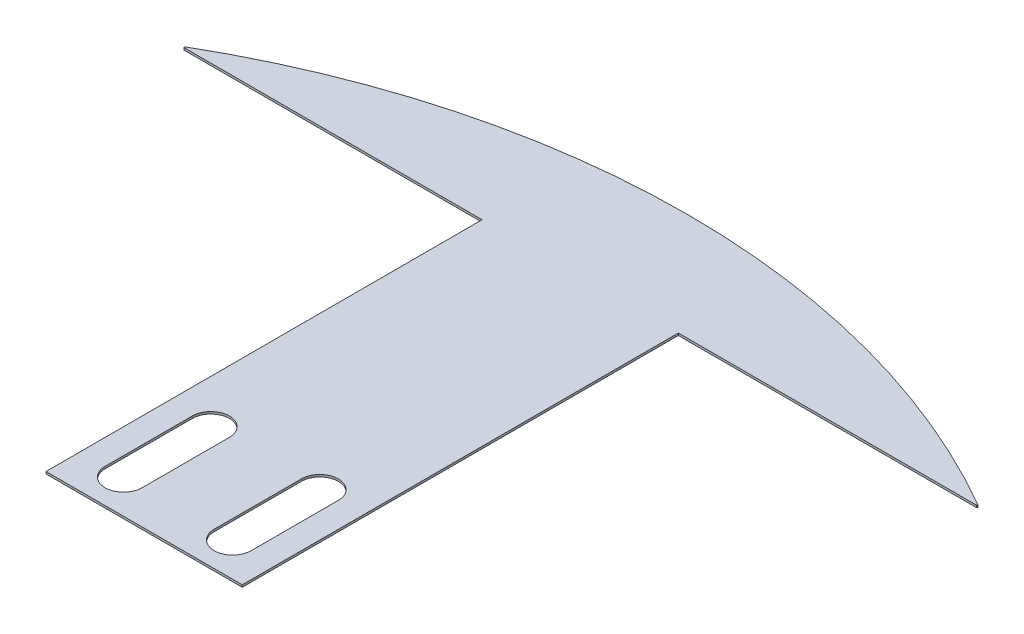
ISO-10303-21;
HEADER;
FILE_DESCRIPTION(('STEP AP214'),'2;1');
FILE_NAME('part.step','',(''),(''),'','','');
FILE_SCHEMA(('AUTOMOTIVE_DESIGN { 1 0 10303 214 1 1 1 1 }'));
ENDSEC;
DATA;
#1=APPLICATION_CONTEXT('core data for automotive mechanical design processes');
#2=APPLICATION_PROTOCOL_DEFINITION('international standard','automotive_design',2000,#1);
#3=PRODUCT_CONTEXT('',#1,'mechanical');
#4=PRODUCT('Part','Part','',(#3));
#5=PRODUCT_RELATED_PRODUCT_CATEGORY('part','',(#4));
#6=PRODUCT_DEFINITION_FORMATION('','',#4);
#7=PRODUCT_DEFINITION_CONTEXT('part definition',#1,'design');
#8=PRODUCT_DEFINITION('design','',#6,#7);
#9=PRODUCT_DEFINITION_SHAPE('','',#8);
#10=(LENGTH_UNIT() NAMED_UNIT(*) SI_UNIT(.MILLI.,.METRE.));
#11=(NAMED_UNIT(*) PLANE_ANGLE_UNIT() SI_UNIT($,.RADIAN.));
#12=(NAMED_UNIT(*) SI_UNIT($,.STERADIAN.) SOLID_ANGLE_UNIT());
#13=UNCERTAINTY_MEASURE_WITH_UNIT(LENGTH_MEASURE(1.E-05),#10,'distance_accuracy_value','');
#14=(GEOMETRIC_REPRESENTATION_CONTEXT(3) GLOBAL_UNCERTAINTY_ASSIGNED_CONTEXT((#13)) GLOBAL_UNIT_ASSIGNED_CONTEXT((#10,
#11,#12)) REPRESENTATION_CONTEXT('',''));
#15=CARTESIAN_POINT('',(0.,0.,0.));
#16=DIRECTION('',(0.,0.,1.));
#17=DIRECTION('',(1.,0.,0.));
#18=AXIS2_PLACEMENT_3D('',#15,#16,#17);
#19=CARTESIAN_POINT('',(0.,0.25,0.));
#20=DIRECTION('',(0.,-1.,0.));
#21=DIRECTION('',(0.,0.,-1.));
#22=AXIS2_PLACEMENT_3D('',#19,#20,#21);
#23=PLANE('',#22);
#24=CARTESIAN_POINT('',(-12.5000000000003,0.25,-85.1948049604864));
#25=DIRECTION('',(0.,1.,0.));
#26=DIRECTION('',(0.,0.,-1.));
#27=AXIS2_PLACEMENT_3D('',#24,#25,#26);
#28=CIRCLE('',#27,4.25);
#29=CARTESIAN_POINT('',(-8.25000000000027,0.25,-85.1948049604864));
#30=VERTEX_POINT('',#29);
#31=CARTESIAN_POINT('',(-16.7500000000003,0.25,-85.1948049604864));
#32=VERTEX_POINT('',#31);
#33=EDGE_CURVE('E186',#30,#32,#28,.T.);
#34=ORIENTED_EDGE('',*,*,#33,.F.);
#35=DIRECTION('',(0.,0.,-1.));
#36=VECTOR('',#35,1.);
#37=CARTESIAN_POINT('',(-8.25000000000027,0.25,-85.1948049604864));
#38=LINE('',#37,#36);
#39=CARTESIAN_POINT('',(-8.25000000000026,0.25,-65.1948049604864));
#40=VERTEX_POINT('',#39);
#41=EDGE_CURVE('E194',#40,#30,#38,.T.);
#42=ORIENTED_EDGE('',*,*,#41,.F.);
#43=CARTESIAN_POINT('',(-12.5000000000003,0.25,-65.1948049604864));
#44=DIRECTION('',(0.,1.,0.));
#45=DIRECTION('',(0.,0.,-1.));
#46=AXIS2_PLACEMENT_3D('',#43,#44,#45);
#47=CIRCLE('',#46,4.25);
#48=CARTESIAN_POINT('',(-16.7500000000003,0.25,-65.1948049604864));
#49=VERTEX_POINT('',#48);
#50=EDGE_CURVE('E191',#49,#40,#47,.T.);
#51=ORIENTED_EDGE('',*,*,#50,.F.);
#52=DIRECTION('',(0.,0.,1.));
#53=VECTOR('',#52,1.);
#54=CARTESIAN_POINT('',(-16.7500000000003,0.25,-85.1948049604864));
#55=LINE('',#54,#53);
#56=EDGE_CURVE('E188',#32,#49,#55,.T.);
#57=ORIENTED_EDGE('',*,*,#56,.F.);
#58=EDGE_LOOP('',(#34,#42,#51,#57));
#59=FACE_BOUND('',#58,.T.);
#60=DIRECTION('',(0.,0.,1.));
#61=VECTOR('',#60,1.);
#62=CARTESIAN_POINT('',(-22.5000000000003,0.25,-57.3948049604864));
#63=LINE('',#62,#61);
#64=CARTESIAN_POINT('',(-22.5000000000003,0.25,-157.394804960486));
#65=VERTEX_POINT('',#64);
#66=CARTESIAN_POINT('',(-22.5000000000003,0.25,-57.3948049604864));
#67=VERTEX_POINT('',#66);
#68=EDGE_CURVE('E217',#65,#67,#63,.T.);
#69=ORIENTED_EDGE('',*,*,#68,.T.);
#70=DIRECTION('',(1.,0.,0.));
#71=VECTOR('',#70,1.);
#72=CARTESIAN_POINT('',(-22.5000000000003,0.25,-57.3948049604864));
#73=LINE('',#72,#71);
#74=CARTESIAN_POINT('',(22.4999999999997,0.25,-57.3948049604864));
#75=VERTEX_POINT('',#74);
#76=EDGE_CURVE('E220',#67,#75,#73,.T.);
#77=ORIENTED_EDGE('',*,*,#76,.T.);
#78=DIRECTION('',(0.,0.,-1.));
#79=VECTOR('',#78,1.);
#80=CARTESIAN_POINT('',(22.4999999999997,0.25,-57.3948049604864));
#81=LINE('',#80,#79);
#82=CARTESIAN_POINT('',(22.4999999999997,0.25,-157.394804960486));
#83=VERTEX_POINT('',#82);
#84=EDGE_CURVE('E223',#75,#83,#81,.T.);
#85=ORIENTED_EDGE('',*,*,#84,.T.);
#86=DIRECTION('',(1.,0.,0.));
#87=VECTOR('',#86,1.);
#88=CARTESIAN_POINT('',(22.4999999999997,0.25,-157.394804960486));
#89=LINE('',#88,#87);
#90=CARTESIAN_POINT('',(90.8719330129854,0.25,-157.394804960486));
#91=VERTEX_POINT('',#90);
#92=EDGE_CURVE('E225',#83,#91,#89,.T.);
#93=ORIENTED_EDGE('',*,*,#92,.T.);
#94=DIRECTION('',(0.49999999999861,0.,-0.866025403785241));
#95=VECTOR('',#94,1.);
#96=CARTESIAN_POINT('',(91.000000000001,0.25,-157.61662348877));
#97=LINE('',#96,#95);
#98=CARTESIAN_POINT('',(91.000000000001,0.25,-157.61662348877));
#99=VERTEX_POINT('',#98);
#100=EDGE_CURVE('E227',#91,#99,#97,.T.);
#101=ORIENTED_EDGE('',*,*,#100,.T.);
#102=CARTESIAN_POINT('',(0.,0.25,0.));
#103=DIRECTION('',(0.,1.,0.));
#104=DIRECTION('',(0.,0.,-1.));
#105=AXIS2_PLACEMENT_3D('',#102,#103,#104);
#106=CIRCLE('',#105,182.000000000001);
#107=CARTESIAN_POINT('',(-91.0000000000001,0.25,-157.616623488769));
#108=VERTEX_POINT('',#107);
#109=EDGE_CURVE('E229',#99,#108,#106,.T.);
#110=ORIENTED_EDGE('',*,*,#109,.T.);
#111=DIRECTION('',(0.500000000000239,0.,0.866025403784301));
#112=VECTOR('',#111,1.);
#113=CARTESIAN_POINT('',(-90.8719330129845,0.25,-157.394804960486));
#114=LINE('',#113,#112);
#115=CARTESIAN_POINT('',(-90.8719330129845,0.25,-157.394804960486));
#116=VERTEX_POINT('',#115);
#117=EDGE_CURVE('E231',#108,#116,#114,.T.);
#118=ORIENTED_EDGE('',*,*,#117,.T.);
#119=DIRECTION('',(1.,0.,0.));
#120=VECTOR('',#119,1.);
#121=CARTESIAN_POINT('',(-90.8719330129845,0.25,-157.394804960486));
#122=LINE('',#121,#120);
#123=EDGE_CURVE('E233',#116,#65,#122,.T.);
#124=ORIENTED_EDGE('',*,*,#123,.T.);
#125=EDGE_LOOP('',(#69,#77,#85,#93,#101,#110,#118,#124));
#126=FACE_BOUND('',#125,.T.);
#127=CARTESIAN_POINT('',(12.4999999999997,0.25,-85.1948049604864));
#128=DIRECTION('',(0.,1.,0.));
#129=DIRECTION('',(0.,0.,1.));
#130=AXIS2_PLACEMENT_3D('',#127,#128,#129);
#131=CIRCLE('',#130,4.25);
#132=CARTESIAN_POINT('',(16.7499999999997,0.25,-85.1948049604864));
#133=VERTEX_POINT('',#132);
#134=CARTESIAN_POINT('',(8.24999999999974,0.25,-85.1948049604864));
#135=VERTEX_POINT('',#134);
#136=EDGE_CURVE('E150',#133,#135,#131,.T.);
#137=ORIENTED_EDGE('',*,*,#136,.F.);
#138=DIRECTION('',(0.,0.,-1.));
#139=VECTOR('',#138,1.);
#140=CARTESIAN_POINT('',(16.7499999999997,0.25,-85.1948049604864));
#141=LINE('',#140,#139);
#142=CARTESIAN_POINT('',(16.7499999999997,0.25,-65.1948049604864));
#143=VERTEX_POINT('',#142);
#144=EDGE_CURVE('E172',#143,#133,#141,.T.);
#145=ORIENTED_EDGE('',*,*,#144,.F.);
#146=CARTESIAN_POINT('',(12.4999999999997,0.25,-65.1948049604864));
#147=DIRECTION('',(0.,1.,0.));
#148=DIRECTION('',(0.,0.,1.));
#149=AXIS2_PLACEMENT_3D('',#146,#147,#148);
#150=CIRCLE('',#149,4.25);
#151=CARTESIAN_POINT('',(8.24999999999974,0.25,-65.1948049604864));
#152=VERTEX_POINT('',#151);
#153=EDGE_CURVE('E170',#152,#143,#150,.T.);
#154=ORIENTED_EDGE('',*,*,#153,.F.);
#155=DIRECTION('',(0.,0.,1.));
#156=VECTOR('',#155,1.);
#157=CARTESIAN_POINT('',(8.24999999999974,0.25,-85.1948049604864));
#158=LINE('',#157,#156);
#159=EDGE_CURVE('E158',#135,#152,#158,.T.);
#160=ORIENTED_EDGE('',*,*,#159,.F.);
#161=EDGE_LOOP('',(#137,#145,#154,#160));
#162=FACE_BOUND('',#161,.T.);
#163=ADVANCED_FACE('F37',(#59,#126,#162),#23,.F.);
#164=CARTESIAN_POINT('',(0.,-0.25,0.));
#165=DIRECTION('',(0.,-1.,0.));
#166=DIRECTION('',(0.,0.,-1.));
#167=AXIS2_PLACEMENT_3D('',#164,#165,#166);
#168=PLANE('',#167);
#169=DIRECTION('',(0.,0.,1.));
#170=VECTOR('',#169,1.);
#171=CARTESIAN_POINT('',(-22.5000000000003,-0.25,-57.3948049604864));
#172=LINE('',#171,#170);
#173=CARTESIAN_POINT('',(-22.5000000000003,-0.25,-157.394804960486));
#174=VERTEX_POINT('',#173);
#175=CARTESIAN_POINT('',(-22.5000000000003,-0.25,-57.3948049604864));
#176=VERTEX_POINT('',#175);
#177=EDGE_CURVE('E216',#174,#176,#172,.T.);
#178=ORIENTED_EDGE('',*,*,#177,.F.);
#179=DIRECTION('',(1.,0.,0.));
#180=VECTOR('',#179,1.);
#181=CARTESIAN_POINT('',(-90.8719330129845,-0.25,-157.394804960486));
#182=LINE('',#181,#180);
#183=CARTESIAN_POINT('',(-90.8719330129845,-0.25,-157.394804960486));
#184=VERTEX_POINT('',#183);
#185=EDGE_CURVE('E221',#184,#174,#182,.T.);
#186=ORIENTED_EDGE('',*,*,#185,.F.);
#187=DIRECTION('',(0.500000000000239,0.,0.866025403784301));
#188=VECTOR('',#187,1.);
#189=CARTESIAN_POINT('',(-90.8719330129845,-0.25,-157.394804960486));
#190=LINE('',#189,#188);
#191=CARTESIAN_POINT('',(-91.0000000000001,-0.25,-157.616623488769));
#192=VERTEX_POINT('',#191);
#193=EDGE_CURVE('E248',#192,#184,#190,.T.);
#194=ORIENTED_EDGE('',*,*,#193,.F.);
#195=CARTESIAN_POINT('',(0.,-0.25,0.));
#196=DIRECTION('',(0.,1.,0.));
#197=DIRECTION('',(0.,0.,-1.));
#198=AXIS2_PLACEMENT_3D('',#195,#196,#197);
#199=CIRCLE('',#198,182.000000000001);
#200=CARTESIAN_POINT('',(91.000000000001,-0.25,-157.61662348877));
#201=VERTEX_POINT('',#200);
#202=EDGE_CURVE('E246',#201,#192,#199,.T.);
#203=ORIENTED_EDGE('',*,*,#202,.F.);
#204=DIRECTION('',(0.49999999999861,0.,-0.866025403785241));
#205=VECTOR('',#204,1.);
#206=CARTESIAN_POINT('',(91.000000000001,-0.25,-157.61662348877));
#207=LINE('',#206,#205);
#208=CARTESIAN_POINT('',(90.8719330129854,-0.25,-157.394804960486));
#209=VERTEX_POINT('',#208);
#210=EDGE_CURVE('E244',#209,#201,#207,.T.);
#211=ORIENTED_EDGE('',*,*,#210,.F.);
#212=DIRECTION('',(1.,0.,0.));
#213=VECTOR('',#212,1.);
#214=CARTESIAN_POINT('',(22.4999999999997,-0.25,-157.394804960486));
#215=LINE('',#214,#213);
#216=CARTESIAN_POINT('',(22.4999999999997,-0.25,-157.394804960486));
#217=VERTEX_POINT('',#216);
#218=EDGE_CURVE('E242',#217,#209,#215,.T.);
#219=ORIENTED_EDGE('',*,*,#218,.F.);
#220=DIRECTION('',(0.,0.,-1.));
#221=VECTOR('',#220,1.);
#222=CARTESIAN_POINT('',(22.4999999999997,-0.25,-57.3948049604864));
#223=LINE('',#222,#221);
#224=CARTESIAN_POINT('',(22.4999999999997,-0.25,-57.3948049604864));
#225=VERTEX_POINT('',#224);
#226=EDGE_CURVE('E240',#225,#217,#223,.T.);
#227=ORIENTED_EDGE('',*,*,#226,.F.);
#228=DIRECTION('',(1.,0.,0.));
#229=VECTOR('',#228,1.);
#230=CARTESIAN_POINT('',(-22.5000000000003,-0.25,-57.3948049604864));
#231=LINE('',#230,#229);
#232=EDGE_CURVE('E238',#176,#225,#231,.T.);
#233=ORIENTED_EDGE('',*,*,#232,.F.);
#234=EDGE_LOOP('',(#178,#186,#194,#203,#211,#219,#227,#233));
#235=FACE_BOUND('',#234,.T.);
#236=DIRECTION('',(0.,0.,-1.));
#237=VECTOR('',#236,1.);
#238=CARTESIAN_POINT('',(-8.25000000000027,-0.25,-85.1948049604864));
#239=LINE('',#238,#237);
#240=CARTESIAN_POINT('',(-8.25000000000026,-0.25,-65.1948049604864));
#241=VERTEX_POINT('',#240);
#242=CARTESIAN_POINT('',(-8.25000000000027,-0.25,-85.1948049604864));
#243=VERTEX_POINT('',#242);
#244=EDGE_CURVE('E189',#241,#243,#239,.T.);
#245=ORIENTED_EDGE('',*,*,#244,.T.);
#246=CARTESIAN_POINT('',(-12.5000000000003,-0.25,-85.1948049604864));
#247=DIRECTION('',(0.,1.,0.));
#248=DIRECTION('',(0.,0.,-1.));
#249=AXIS2_PLACEMENT_3D('',#246,#247,#248);
#250=CIRCLE('',#249,4.25);
#251=CARTESIAN_POINT('',(-16.7500000000003,-0.25,-85.1948049604864));
#252=VERTEX_POINT('',#251);
#253=EDGE_CURVE('E166',#243,#252,#250,.T.);
#254=ORIENTED_EDGE('',*,*,#253,.T.);
#255=DIRECTION('',(0.,0.,1.));
#256=VECTOR('',#255,1.);
#257=CARTESIAN_POINT('',(-16.7500000000003,-0.25,-85.1948049604864));
#258=LINE('',#257,#256);
#259=CARTESIAN_POINT('',(-16.7500000000003,-0.25,-65.1948049604864));
#260=VERTEX_POINT('',#259);
#261=EDGE_CURVE('E199',#252,#260,#258,.T.);
#262=ORIENTED_EDGE('',*,*,#261,.T.);
#263=CARTESIAN_POINT('',(-12.5000000000003,-0.25,-65.1948049604864));
#264=DIRECTION('',(0.,1.,0.));
#265=DIRECTION('',(0.,0.,-1.));
#266=AXIS2_PLACEMENT_3D('',#263,#264,#265);
#267=CIRCLE('',#266,4.25);
#268=EDGE_CURVE('E202',#260,#241,#267,.T.);
#269=ORIENTED_EDGE('',*,*,#268,.T.);
#270=EDGE_LOOP('',(#245,#254,#262,#269));
#271=FACE_BOUND('',#270,.T.);
#272=DIRECTION('',(0.,0.,-1.));
#273=VECTOR('',#272,1.);
#274=CARTESIAN_POINT('',(16.7499999999997,-0.25,-85.1948049604864));
#275=LINE('',#274,#273);
#276=CARTESIAN_POINT('',(16.7499999999997,-0.25,-65.1948049604864));
#277=VERTEX_POINT('',#276);
#278=CARTESIAN_POINT('',(16.7499999999997,-0.25,-85.1948049604864));
#279=VERTEX_POINT('',#278);
#280=EDGE_CURVE('E159',#277,#279,#275,.T.);
#281=ORIENTED_EDGE('',*,*,#280,.T.);
#282=CARTESIAN_POINT('',(12.4999999999997,-0.25,-85.1948049604864));
#283=DIRECTION('',(0.,1.,0.));
#284=DIRECTION('',(0.,0.,1.));
#285=AXIS2_PLACEMENT_3D('',#282,#283,#284);
#286=CIRCLE('',#285,4.25);
#287=CARTESIAN_POINT('',(8.24999999999974,-0.25,-85.1948049604864));
#288=VERTEX_POINT('',#287);
#289=EDGE_CURVE('E60',#279,#288,#286,.T.);
#290=ORIENTED_EDGE('',*,*,#289,.T.);
#291=DIRECTION('',(0.,0.,1.));
#292=VECTOR('',#291,1.);
#293=CARTESIAN_POINT('',(8.24999999999974,-0.25,-85.1948049604864));
#294=LINE('',#293,#292);
#295=CARTESIAN_POINT('',(8.24999999999974,-0.25,-65.1948049604864));
#296=VERTEX_POINT('',#295);
#297=EDGE_CURVE('E165',#288,#296,#294,.T.);
#298=ORIENTED_EDGE('',*,*,#297,.T.);
#299=CARTESIAN_POINT('',(12.4999999999997,-0.25,-65.1948049604864));
#300=DIRECTION('',(0.,1.,0.));
#301=DIRECTION('',(0.,0.,1.));
#302=AXIS2_PLACEMENT_3D('',#299,#300,#301);
#303=CIRCLE('',#302,4.25);
#304=EDGE_CURVE('E178',#296,#277,#303,.T.);
#305=ORIENTED_EDGE('',*,*,#304,.T.);
#306=EDGE_LOOP('',(#281,#290,#298,#305));
#307=FACE_BOUND('',#306,.T.);
#308=ADVANCED_FACE('F278',(#235,#271,#307),#168,.T.);
#309=CARTESIAN_POINT('',(-22.5000000000003,0.25,-57.3948049604864));
#310=DIRECTION('',(1.,0.,0.));
#311=DIRECTION('',(0.,0.,-1.));
#312=AXIS2_PLACEMENT_3D('',#309,#310,#311);
#313=PLANE('',#312);
#314=ORIENTED_EDGE('',*,*,#177,.T.);
#315=DIRECTION('',(0.,-1.,0.));
#316=VECTOR('',#315,1.);
#317=CARTESIAN_POINT('',(-22.5000000000003,0.25,-57.3948049604864));
#318=LINE('',#317,#316);
#319=EDGE_CURVE('E11',#67,#176,#318,.T.);
#320=ORIENTED_EDGE('',*,*,#319,.F.);
#321=ORIENTED_EDGE('',*,*,#68,.F.);
#322=DIRECTION('',(0.,-1.,0.));
#323=VECTOR('',#322,1.);
#324=CARTESIAN_POINT('',(-22.5000000000003,0.25,-157.394804960486));
#325=LINE('',#324,#323);
#326=EDGE_CURVE('E235',#65,#174,#325,.T.);
#327=ORIENTED_EDGE('',*,*,#326,.T.);
#328=EDGE_LOOP('',(#314,#320,#321,#327));
#329=FACE_BOUND('',#328,.T.);
#330=ADVANCED_FACE('F39',(#329),#313,.F.);
#331=CARTESIAN_POINT('',(-22.5000000000003,0.25,-57.3948049604864));
#332=DIRECTION('',(0.,0.,-1.));
#333=DIRECTION('',(-1.,0.,0.));
#334=AXIS2_PLACEMENT_3D('',#331,#332,#333);
#335=PLANE('',#334);
#336=ORIENTED_EDGE('',*,*,#232,.T.);
#337=DIRECTION('',(0.,-1.,0.));
#338=VECTOR('',#337,1.);
#339=CARTESIAN_POINT('',(22.4999999999997,0.25,-57.3948049604864));
#340=LINE('',#339,#338);
#341=EDGE_CURVE('E45',#75,#225,#340,.T.);
#342=ORIENTED_EDGE('',*,*,#341,.F.);
#343=ORIENTED_EDGE('',*,*,#76,.F.);
#344=ORIENTED_EDGE('',*,*,#319,.T.);
#345=EDGE_LOOP('',(#336,#342,#343,#344));
#346=FACE_BOUND('',#345,.T.);
#347=ADVANCED_FACE('F295',(#346),#335,.F.);
#348=CARTESIAN_POINT('',(22.4999999999997,0.25,-57.3948049604864));
#349=DIRECTION('',(-1.,0.,0.));
#350=DIRECTION('',(0.,0.,1.));
#351=AXIS2_PLACEMENT_3D('',#348,#349,#350);
#352=PLANE('',#351);
#353=ORIENTED_EDGE('',*,*,#226,.T.);
#354=DIRECTION('',(0.,-1.,0.));
#355=VECTOR('',#354,1.);
#356=CARTESIAN_POINT('',(22.4999999999997,0.25,-157.394804960486));
#357=LINE('',#356,#355);
#358=EDGE_CURVE('E265',#83,#217,#357,.T.);
#359=ORIENTED_EDGE('',*,*,#358,.F.);
#360=ORIENTED_EDGE('',*,*,#84,.F.);
#361=ORIENTED_EDGE('',*,*,#341,.T.);
#362=EDGE_LOOP('',(#353,#359,#360,#361));
#363=FACE_BOUND('',#362,.T.);
#364=ADVANCED_FACE('F272',(#363),#352,.F.);
#365=CARTESIAN_POINT('',(22.4999999999997,0.25,-157.394804960486));
#366=DIRECTION('',(0.,0.,-1.));
#367=DIRECTION('',(-1.,0.,0.));
#368=AXIS2_PLACEMENT_3D('',#365,#366,#367);
#369=PLANE('',#368);
#370=ORIENTED_EDGE('',*,*,#218,.T.);
#371=DIRECTION('',(0.,-1.,0.));
#372=VECTOR('',#371,1.);
#373=CARTESIAN_POINT('',(90.8719330129854,0.25,-157.394804960486));
#374=LINE('',#373,#372);
#375=EDGE_CURVE('E262',#91,#209,#374,.T.);
#376=ORIENTED_EDGE('',*,*,#375,.F.);
#377=ORIENTED_EDGE('',*,*,#92,.F.);
#378=ORIENTED_EDGE('',*,*,#358,.T.);
#379=EDGE_LOOP('',(#370,#376,#377,#378));
#380=FACE_BOUND('',#379,.T.);
#381=ADVANCED_FACE('F284',(#380),#369,.F.);
#382=CARTESIAN_POINT('',(91.000000000001,0.25,-157.61662348877));
#383=DIRECTION('',(-0.866025403785241,0.,-0.49999999999861));
#384=DIRECTION('',(-0.49999999999861,0.,0.866025403785241));
#385=AXIS2_PLACEMENT_3D('',#382,#383,#384);
#386=PLANE('',#385);
#387=ORIENTED_EDGE('',*,*,#210,.T.);
#388=DIRECTION('',(0.,-1.,0.));
#389=VECTOR('',#388,1.);
#390=CARTESIAN_POINT('',(91.000000000001,0.25,-157.61662348877));
#391=LINE('',#390,#389);
#392=EDGE_CURVE('E259',#99,#201,#391,.T.);
#393=ORIENTED_EDGE('',*,*,#392,.F.);
#394=ORIENTED_EDGE('',*,*,#100,.F.);
#395=ORIENTED_EDGE('',*,*,#375,.T.);
#396=EDGE_LOOP('',(#387,#393,#394,#395));
#397=FACE_BOUND('',#396,.T.);
#398=ADVANCED_FACE('F288',(#397),#386,.F.);
#399=CARTESIAN_POINT('',(0.,0.25,0.));
#400=DIRECTION('',(0.,-1.,0.));
#401=DIRECTION('',(0.,0.,-1.));
#402=AXIS2_PLACEMENT_3D('',#399,#400,#401);
#403=CYLINDRICAL_SURFACE('',#402,182.000000000001);
#404=ORIENTED_EDGE('',*,*,#202,.T.);
#405=DIRECTION('',(0.,-1.,0.));
#406=VECTOR('',#405,1.);
#407=CARTESIAN_POINT('',(-91.0000000000001,0.25,-157.616623488769));
#408=LINE('',#407,#406);
#409=EDGE_CURVE('E256',#108,#192,#408,.T.);
#410=ORIENTED_EDGE('',*,*,#409,.F.);
#411=ORIENTED_EDGE('',*,*,#109,.F.);
#412=ORIENTED_EDGE('',*,*,#392,.T.);
#413=EDGE_LOOP('',(#404,#410,#411,#412));
#414=FACE_BOUND('',#413,.T.);
#415=ADVANCED_FACE('F308',(#414),#403,.T.);
#416=CARTESIAN_POINT('',(-90.8719330129845,0.25,-157.394804960486));
#417=DIRECTION('',(0.866025403784301,0.,-0.500000000000239));
#418=DIRECTION('',(-0.500000000000239,0.,-0.866025403784301));
#419=AXIS2_PLACEMENT_3D('',#416,#417,#418);
#420=PLANE('',#419);
#421=ORIENTED_EDGE('',*,*,#193,.T.);
#422=DIRECTION('',(0.,-1.,0.));
#423=VECTOR('',#422,1.);
#424=CARTESIAN_POINT('',(-90.8719330129845,0.25,-157.394804960486));
#425=LINE('',#424,#423);
#426=EDGE_CURVE('E253',#116,#184,#425,.T.);
#427=ORIENTED_EDGE('',*,*,#426,.F.);
#428=ORIENTED_EDGE('',*,*,#117,.F.);
#429=ORIENTED_EDGE('',*,*,#409,.T.);
#430=EDGE_LOOP('',(#421,#427,#428,#429));
#431=FACE_BOUND('',#430,.T.);
#432=ADVANCED_FACE('F306',(#431),#420,.F.);
#433=CARTESIAN_POINT('',(-90.8719330129845,0.25,-157.394804960486));
#434=DIRECTION('',(0.,0.,-1.));
#435=DIRECTION('',(-1.,0.,0.));
#436=AXIS2_PLACEMENT_3D('',#433,#434,#435);
#437=PLANE('',#436);
#438=ORIENTED_EDGE('',*,*,#185,.T.);
#439=ORIENTED_EDGE('',*,*,#326,.F.);
#440=ORIENTED_EDGE('',*,*,#123,.F.);
#441=ORIENTED_EDGE('',*,*,#426,.T.);
#442=EDGE_LOOP('',(#438,#439,#440,#441));
#443=FACE_BOUND('',#442,.T.);
#444=ADVANCED_FACE('F301',(#443),#437,.F.);
#445=CARTESIAN_POINT('',(-12.5000000000003,0.25,-85.1948049604864));
#446=DIRECTION('',(0.,-1.,0.));
#447=DIRECTION('',(0.,0.,-1.));
#448=AXIS2_PLACEMENT_3D('',#445,#446,#447);
#449=CYLINDRICAL_SURFACE('',#448,4.25);
#450=ORIENTED_EDGE('',*,*,#253,.F.);
#451=DIRECTION('',(0.,-1.,0.));
#452=VECTOR('',#451,1.);
#453=CARTESIAN_POINT('',(-8.25000000000027,0.25,-85.1948049604864));
#454=LINE('',#453,#452);
#455=EDGE_CURVE('E196',#30,#243,#454,.T.);
#456=ORIENTED_EDGE('',*,*,#455,.F.);
#457=ORIENTED_EDGE('',*,*,#33,.T.);
#458=DIRECTION('',(0.,-1.,0.));
#459=VECTOR('',#458,1.);
#460=CARTESIAN_POINT('',(-16.7500000000003,0.25,-85.1948049604864));
#461=LINE('',#460,#459);
#462=EDGE_CURVE('E213',#32,#252,#461,.T.);
#463=ORIENTED_EDGE('',*,*,#462,.T.);
#464=EDGE_LOOP('',(#450,#456,#457,#463));
#465=FACE_BOUND('',#464,.T.);
#466=ADVANCED_FACE('F326',(#465),#449,.F.);
#467=CARTESIAN_POINT('',(-16.7500000000003,0.25,-85.1948049604864));
#468=DIRECTION('',(1.,0.,0.));
#469=DIRECTION('',(0.,0.,-1.));
#470=AXIS2_PLACEMENT_3D('',#467,#468,#469);
#471=PLANE('',#470);
#472=ORIENTED_EDGE('',*,*,#261,.F.);
#473=ORIENTED_EDGE('',*,*,#462,.F.);
#474=ORIENTED_EDGE('',*,*,#56,.T.);
#475=DIRECTION('',(0.,-1.,0.));
#476=VECTOR('',#475,1.);
#477=CARTESIAN_POINT('',(-16.7500000000003,0.25,-65.1948049604864));
#478=LINE('',#477,#476);
#479=EDGE_CURVE('E211',#49,#260,#478,.T.);
#480=ORIENTED_EDGE('',*,*,#479,.T.);
#481=EDGE_LOOP('',(#472,#473,#474,#480));
#482=FACE_BOUND('',#481,.T.);
#483=ADVANCED_FACE('F333',(#482),#471,.T.);
#484=CARTESIAN_POINT('',(-12.5000000000003,0.25,-65.1948049604864));
#485=DIRECTION('',(0.,-1.,0.));
#486=DIRECTION('',(0.,0.,-1.));
#487=AXIS2_PLACEMENT_3D('',#484,#485,#486);
#488=CYLINDRICAL_SURFACE('',#487,4.25);
#489=ORIENTED_EDGE('',*,*,#268,.F.);
#490=ORIENTED_EDGE('',*,*,#479,.F.);
#491=ORIENTED_EDGE('',*,*,#50,.T.);
#492=DIRECTION('',(0.,-1.,0.));
#493=VECTOR('',#492,1.);
#494=CARTESIAN_POINT('',(-8.25000000000026,0.25,-65.1948049604864));
#495=LINE('',#494,#493);
#496=EDGE_CURVE('E209',#40,#241,#495,.T.);
#497=ORIENTED_EDGE('',*,*,#496,.T.);
#498=EDGE_LOOP('',(#489,#490,#491,#497));
#499=FACE_BOUND('',#498,.T.);
#500=ADVANCED_FACE('F338',(#499),#488,.F.);
#501=CARTESIAN_POINT('',(-8.25000000000027,0.25,-85.1948049604864));
#502=DIRECTION('',(-1.,0.,0.));
#503=DIRECTION('',(0.,0.,1.));
#504=AXIS2_PLACEMENT_3D('',#501,#502,#503);
#505=PLANE('',#504);
#506=ORIENTED_EDGE('',*,*,#244,.F.);
#507=ORIENTED_EDGE('',*,*,#496,.F.);
#508=ORIENTED_EDGE('',*,*,#41,.T.);
#509=ORIENTED_EDGE('',*,*,#455,.T.);
#510=EDGE_LOOP('',(#506,#507,#508,#509));
#511=FACE_BOUND('',#510,.T.);
#512=ADVANCED_FACE('F344',(#511),#505,.T.);
#513=CARTESIAN_POINT('',(12.4999999999997,0.25,-85.1948049604864));
#514=DIRECTION('',(0.,-1.,0.));
#515=DIRECTION('',(0.,0.,-1.));
#516=AXIS2_PLACEMENT_3D('',#513,#514,#515);
#517=CYLINDRICAL_SURFACE('',#516,4.25);
#518=ORIENTED_EDGE('',*,*,#289,.F.);
#519=DIRECTION('',(0.,-1.,0.));
#520=VECTOR('',#519,1.);
#521=CARTESIAN_POINT('',(16.7499999999997,0.25,-85.1948049604864));
#522=LINE('',#521,#520);
#523=EDGE_CURVE('E154',#133,#279,#522,.T.);
#524=ORIENTED_EDGE('',*,*,#523,.F.);
#525=ORIENTED_EDGE('',*,*,#136,.T.);
#526=DIRECTION('',(0.,-1.,0.));
#527=VECTOR('',#526,1.);
#528=CARTESIAN_POINT('',(8.24999999999974,0.25,-85.1948049604864));
#529=LINE('',#528,#527);
#530=EDGE_CURVE('E153',#135,#288,#529,.T.);
#531=ORIENTED_EDGE('',*,*,#530,.T.);
#532=EDGE_LOOP('',(#518,#524,#525,#531));
#533=FACE_BOUND('',#532,.T.);
#534=ADVANCED_FACE('F152',(#533),#517,.F.);
#535=CARTESIAN_POINT('',(8.24999999999974,0.25,-85.1948049604864));
#536=DIRECTION('',(1.,0.,0.));
#537=DIRECTION('',(0.,0.,-1.));
#538=AXIS2_PLACEMENT_3D('',#535,#536,#537);
#539=PLANE('',#538);
#540=ORIENTED_EDGE('',*,*,#297,.F.);
#541=ORIENTED_EDGE('',*,*,#530,.F.);
#542=ORIENTED_EDGE('',*,*,#159,.T.);
#543=DIRECTION('',(0.,-1.,0.));
#544=VECTOR('',#543,1.);
#545=CARTESIAN_POINT('',(8.24999999999974,0.25,-65.1948049604864));
#546=LINE('',#545,#544);
#547=EDGE_CURVE('E167',#152,#296,#546,.T.);
#548=ORIENTED_EDGE('',*,*,#547,.T.);
#549=EDGE_LOOP('',(#540,#541,#542,#548));
#550=FACE_BOUND('',#549,.T.);
#551=ADVANCED_FACE('F162',(#550),#539,.T.);
#552=CARTESIAN_POINT('',(12.4999999999997,0.25,-65.1948049604864));
#553=DIRECTION('',(0.,-1.,0.));
#554=DIRECTION('',(0.,0.,-1.));
#555=AXIS2_PLACEMENT_3D('',#552,#553,#554);
#556=CYLINDRICAL_SURFACE('',#555,4.25);
#557=ORIENTED_EDGE('',*,*,#304,.F.);
#558=ORIENTED_EDGE('',*,*,#547,.F.);
#559=ORIENTED_EDGE('',*,*,#153,.T.);
#560=DIRECTION('',(0.,-1.,0.));
#561=VECTOR('',#560,1.);
#562=CARTESIAN_POINT('',(16.7499999999997,0.25,-65.1948049604864));
#563=LINE('',#562,#561);
#564=EDGE_CURVE('E52',#143,#277,#563,.T.);
#565=ORIENTED_EDGE('',*,*,#564,.T.);
#566=EDGE_LOOP('',(#557,#558,#559,#565));
#567=FACE_BOUND('',#566,.T.);
#568=ADVANCED_FACE('F363',(#567),#556,.F.);
#569=CARTESIAN_POINT('',(16.7499999999997,0.25,-85.1948049604864));
#570=DIRECTION('',(-1.,0.,0.));
#571=DIRECTION('',(0.,0.,1.));
#572=AXIS2_PLACEMENT_3D('',#569,#570,#571);
#573=PLANE('',#572);
#574=ORIENTED_EDGE('',*,*,#280,.F.);
#575=ORIENTED_EDGE('',*,*,#564,.F.);
#576=ORIENTED_EDGE('',*,*,#144,.T.);
#577=ORIENTED_EDGE('',*,*,#523,.T.);
#578=EDGE_LOOP('',(#574,#575,#576,#577));
#579=FACE_BOUND('',#578,.T.);
#580=ADVANCED_FACE('F366',(#579),#573,.T.);
#581=CLOSED_SHELL('',(#163,#308,#330,#347,#364,#381,#398,#415,#432,#444,#466,#483,#500,#512,
#534,#551,#568,#580));
#582=MANIFOLD_SOLID_BREP('B2',#581);
#583=ADVANCED_BREP_SHAPE_REPRESENTATION('',(#18,#582),#14);
#584=SHAPE_DEFINITION_REPRESENTATION(#9,#583);
ENDSEC;
END-ISO-10303-21;
